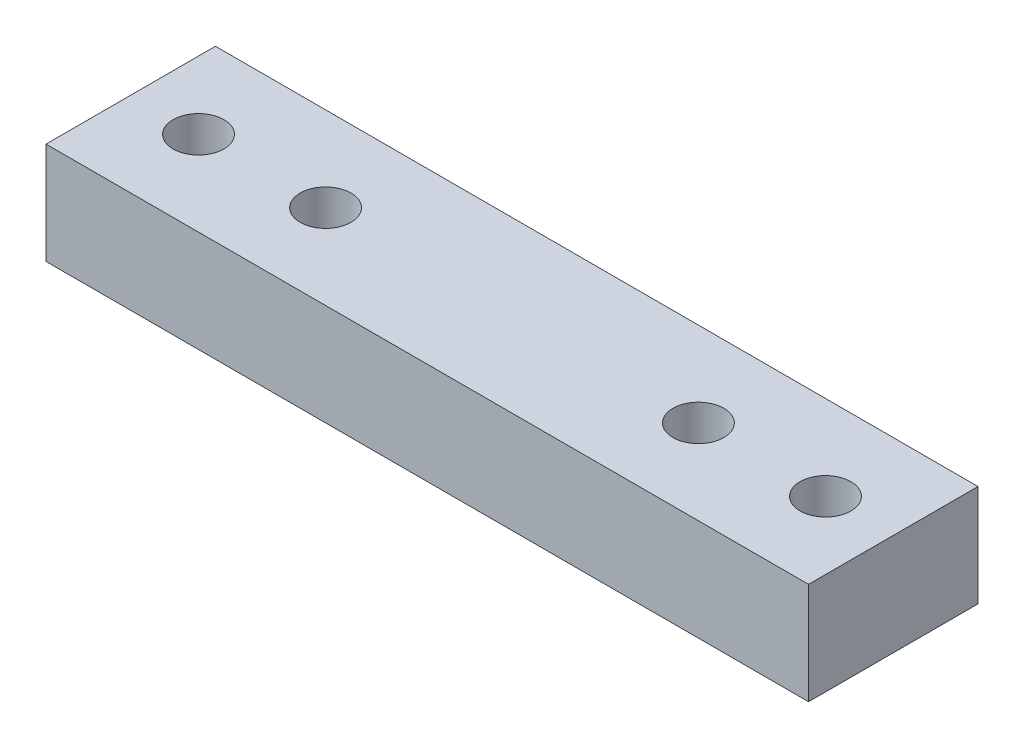
ISO-10303-21;
HEADER;
FILE_DESCRIPTION(('STEP AP214'),'2;1');
FILE_NAME('part.step','',(''),(''),'','','');
FILE_SCHEMA(('AUTOMOTIVE_DESIGN { 1 0 10303 214 1 1 1 1 }'));
ENDSEC;
DATA;
#1=APPLICATION_CONTEXT('core data for automotive mechanical design processes');
#2=APPLICATION_PROTOCOL_DEFINITION('international standard','automotive_design',2000,#1);
#3=PRODUCT_CONTEXT('',#1,'mechanical');
#4=PRODUCT('Part','Part','',(#3));
#5=PRODUCT_RELATED_PRODUCT_CATEGORY('part','',(#4));
#6=PRODUCT_DEFINITION_FORMATION('','',#4);
#7=PRODUCT_DEFINITION_CONTEXT('part definition',#1,'design');
#8=PRODUCT_DEFINITION('design','',#6,#7);
#9=PRODUCT_DEFINITION_SHAPE('','',#8);
#10=(LENGTH_UNIT() NAMED_UNIT(*) SI_UNIT(.MILLI.,.METRE.));
#11=(NAMED_UNIT(*) PLANE_ANGLE_UNIT() SI_UNIT($,.RADIAN.));
#12=(NAMED_UNIT(*) SI_UNIT($,.STERADIAN.) SOLID_ANGLE_UNIT());
#13=UNCERTAINTY_MEASURE_WITH_UNIT(LENGTH_MEASURE(1.E-05),#10,'distance_accuracy_value','');
#14=(GEOMETRIC_REPRESENTATION_CONTEXT(3) GLOBAL_UNCERTAINTY_ASSIGNED_CONTEXT((#13)) GLOBAL_UNIT_ASSIGNED_CONTEXT((#10,
#11,#12)) REPRESENTATION_CONTEXT('',''));
#15=CARTESIAN_POINT('',(0.,0.,0.));
#16=DIRECTION('',(0.,0.,1.));
#17=DIRECTION('',(1.,0.,0.));
#18=AXIS2_PLACEMENT_3D('',#15,#16,#17);
#19=CARTESIAN_POINT('',(0.,6.,0.));
#20=DIRECTION('',(0.,1.,0.));
#21=DIRECTION('',(0.,0.,1.));
#22=AXIS2_PLACEMENT_3D('',#19,#20,#21);
#23=PLANE('',#22);
#24=CARTESIAN_POINT('',(22.4036731046592,6.,-1.50232018561485));
#25=DIRECTION('',(0.,1.,0.));
#26=DIRECTION('',(0.,0.,-1.));
#27=AXIS2_PLACEMENT_3D('',#24,#25,#26);
#28=CIRCLE('',#27,1.5);
#29=CARTESIAN_POINT('',(22.4036731046592,6.,-3.00232018561485));
#30=VERTEX_POINT('',#29);
#31=EDGE_CURVE('E121',#30,#30,#28,.T.);
#32=ORIENTED_EDGE('',*,*,#31,.F.);
#33=EDGE_LOOP('',(#32));
#34=FACE_BOUND('',#33,.T.);
#35=CARTESIAN_POINT('',(-14.5963268953408,6.,-1.50232018561485));
#36=DIRECTION('',(0.,1.,0.));
#37=DIRECTION('',(0.,0.,1.));
#38=AXIS2_PLACEMENT_3D('',#35,#36,#37);
#39=CIRCLE('',#38,1.5);
#40=CARTESIAN_POINT('',(-14.5963268953408,6.,-0.00232018561484824));
#41=VERTEX_POINT('',#40);
#42=EDGE_CURVE('E100',#41,#41,#39,.T.);
#43=ORIENTED_EDGE('',*,*,#42,.F.);
#44=EDGE_LOOP('',(#43));
#45=FACE_BOUND('',#44,.T.);
#46=DIRECTION('',(0.,0.,1.));
#47=VECTOR('',#46,1.);
#48=CARTESIAN_POINT('',(-18.5963268953408,6.,-6.50232018561485));
#49=LINE('',#48,#47);
#50=CARTESIAN_POINT('',(-18.5963268953408,6.,-6.50232018561485));
#51=VERTEX_POINT('',#50);
#52=CARTESIAN_POINT('',(-18.5963268953408,6.,3.49767981438515));
#53=VERTEX_POINT('',#52);
#54=EDGE_CURVE('E85',#51,#53,#49,.T.);
#55=ORIENTED_EDGE('',*,*,#54,.T.);
#56=DIRECTION('',(1.,0.,0.));
#57=VECTOR('',#56,1.);
#58=CARTESIAN_POINT('',(-18.5963268953408,6.,3.49767981438515));
#59=LINE('',#58,#57);
#60=CARTESIAN_POINT('',(26.4036731046592,6.,3.49767981438515));
#61=VERTEX_POINT('',#60);
#62=EDGE_CURVE('E80',#53,#61,#59,.T.);
#63=ORIENTED_EDGE('',*,*,#62,.T.);
#64=DIRECTION('',(0.,0.,-1.));
#65=VECTOR('',#64,1.);
#66=CARTESIAN_POINT('',(26.4036731046592,6.,-6.50232018561485));
#67=LINE('',#66,#65);
#68=CARTESIAN_POINT('',(26.4036731046592,6.,-6.50232018561485));
#69=VERTEX_POINT('',#68);
#70=EDGE_CURVE('E83',#61,#69,#67,.T.);
#71=ORIENTED_EDGE('',*,*,#70,.T.);
#72=DIRECTION('',(-1.,0.,0.));
#73=VECTOR('',#72,1.);
#74=CARTESIAN_POINT('',(-18.5963268953408,6.,-6.50232018561485));
#75=LINE('',#74,#73);
#76=EDGE_CURVE('E50',#69,#51,#75,.T.);
#77=ORIENTED_EDGE('',*,*,#76,.T.);
#78=EDGE_LOOP('',(#55,#63,#71,#77));
#79=FACE_BOUND('',#78,.T.);
#80=CARTESIAN_POINT('',(-7.0963268953408,6.,-1.50232018561485));
#81=DIRECTION('',(0.,1.,0.));
#82=DIRECTION('',(0.,0.,1.));
#83=AXIS2_PLACEMENT_3D('',#80,#81,#82);
#84=CIRCLE('',#83,1.5);
#85=CARTESIAN_POINT('',(-7.0963268953408,6.,-0.00232018561484803));
#86=VERTEX_POINT('',#85);
#87=EDGE_CURVE('E115',#86,#86,#84,.T.);
#88=ORIENTED_EDGE('',*,*,#87,.F.);
#89=EDGE_LOOP('',(#88));
#90=FACE_BOUND('',#89,.T.);
#91=CARTESIAN_POINT('',(14.9036731046592,6.,-1.50232018561485));
#92=DIRECTION('',(0.,1.,0.));
#93=DIRECTION('',(0.,0.,-1.));
#94=AXIS2_PLACEMENT_3D('',#91,#92,#93);
#95=CIRCLE('',#94,1.5);
#96=CARTESIAN_POINT('',(14.9036731046592,6.,-3.00232018561485));
#97=VERTEX_POINT('',#96);
#98=EDGE_CURVE('E127',#97,#97,#95,.T.);
#99=ORIENTED_EDGE('',*,*,#98,.F.);
#100=EDGE_LOOP('',(#99));
#101=FACE_BOUND('',#100,.T.);
#102=ADVANCED_FACE('F33',(#34,#45,#79,#90,#101),#23,.T.);
#103=CARTESIAN_POINT('',(0.,0.,0.));
#104=DIRECTION('',(0.,1.,0.));
#105=DIRECTION('',(0.,0.,1.));
#106=AXIS2_PLACEMENT_3D('',#103,#104,#105);
#107=PLANE('',#106);
#108=DIRECTION('',(0.,0.,1.));
#109=VECTOR('',#108,1.);
#110=CARTESIAN_POINT('',(-18.5963268953408,0.,-6.50232018561485));
#111=LINE('',#110,#109);
#112=CARTESIAN_POINT('',(-18.5963268953408,0.,-6.50232018561485));
#113=VERTEX_POINT('',#112);
#114=CARTESIAN_POINT('',(-18.5963268953408,0.,3.49767981438515));
#115=VERTEX_POINT('',#114);
#116=EDGE_CURVE('E97',#113,#115,#111,.T.);
#117=ORIENTED_EDGE('',*,*,#116,.F.);
#118=DIRECTION('',(-1.,0.,0.));
#119=VECTOR('',#118,1.);
#120=CARTESIAN_POINT('',(-18.5963268953408,0.,-6.50232018561485));
#121=LINE('',#120,#119);
#122=CARTESIAN_POINT('',(26.4036731046592,0.,-6.50232018561485));
#123=VERTEX_POINT('',#122);
#124=EDGE_CURVE('E73',#123,#113,#121,.T.);
#125=ORIENTED_EDGE('',*,*,#124,.F.);
#126=DIRECTION('',(0.,0.,-1.));
#127=VECTOR('',#126,1.);
#128=CARTESIAN_POINT('',(26.4036731046592,0.,-6.50232018561485));
#129=LINE('',#128,#127);
#130=CARTESIAN_POINT('',(26.4036731046592,0.,3.49767981438515));
#131=VERTEX_POINT('',#130);
#132=EDGE_CURVE('E67',#131,#123,#129,.T.);
#133=ORIENTED_EDGE('',*,*,#132,.F.);
#134=DIRECTION('',(1.,0.,0.));
#135=VECTOR('',#134,1.);
#136=CARTESIAN_POINT('',(-18.5963268953408,0.,3.49767981438515));
#137=LINE('',#136,#135);
#138=EDGE_CURVE('E89',#115,#131,#137,.T.);
#139=ORIENTED_EDGE('',*,*,#138,.F.);
#140=EDGE_LOOP('',(#117,#125,#133,#139));
#141=FACE_BOUND('',#140,.T.);
#142=CARTESIAN_POINT('',(-14.5963268953408,0.,-1.50232018561485));
#143=DIRECTION('',(0.,1.,0.));
#144=DIRECTION('',(0.,0.,1.));
#145=AXIS2_PLACEMENT_3D('',#142,#143,#144);
#146=CIRCLE('',#145,1.5);
#147=CARTESIAN_POINT('',(-14.5963268953408,0.,-0.00232018561484824));
#148=VERTEX_POINT('',#147);
#149=EDGE_CURVE('E112',#148,#148,#146,.T.);
#150=ORIENTED_EDGE('',*,*,#149,.T.);
#151=EDGE_LOOP('',(#150));
#152=FACE_BOUND('',#151,.T.);
#153=CARTESIAN_POINT('',(-7.0963268953408,0.,-1.50232018561485));
#154=DIRECTION('',(0.,1.,0.));
#155=DIRECTION('',(0.,0.,1.));
#156=AXIS2_PLACEMENT_3D('',#153,#154,#155);
#157=CIRCLE('',#156,1.5);
#158=CARTESIAN_POINT('',(-7.0963268953408,0.,-0.00232018561484803));
#159=VERTEX_POINT('',#158);
#160=EDGE_CURVE('E118',#159,#159,#157,.T.);
#161=ORIENTED_EDGE('',*,*,#160,.T.);
#162=EDGE_LOOP('',(#161));
#163=FACE_BOUND('',#162,.T.);
#164=CARTESIAN_POINT('',(22.4036731046592,0.,-1.50232018561485));
#165=DIRECTION('',(0.,1.,0.));
#166=DIRECTION('',(0.,0.,-1.));
#167=AXIS2_PLACEMENT_3D('',#164,#165,#166);
#168=CIRCLE('',#167,1.5);
#169=CARTESIAN_POINT('',(22.4036731046592,0.,-3.00232018561485));
#170=VERTEX_POINT('',#169);
#171=EDGE_CURVE('E124',#170,#170,#168,.T.);
#172=ORIENTED_EDGE('',*,*,#171,.T.);
#173=EDGE_LOOP('',(#172));
#174=FACE_BOUND('',#173,.T.);
#175=CARTESIAN_POINT('',(14.9036731046592,0.,-1.50232018561485));
#176=DIRECTION('',(0.,1.,0.));
#177=DIRECTION('',(0.,0.,-1.));
#178=AXIS2_PLACEMENT_3D('',#175,#176,#177);
#179=CIRCLE('',#178,1.5);
#180=CARTESIAN_POINT('',(14.9036731046592,0.,-3.00232018561485));
#181=VERTEX_POINT('',#180);
#182=EDGE_CURVE('E130',#181,#181,#179,.T.);
#183=ORIENTED_EDGE('',*,*,#182,.T.);
#184=EDGE_LOOP('',(#183));
#185=FACE_BOUND('',#184,.T.);
#186=ADVANCED_FACE('F108',(#141,#152,#163,#174,#185),#107,.F.);
#187=CARTESIAN_POINT('',(-18.5963268953408,6.,-6.50232018561485));
#188=DIRECTION('',(1.,0.,0.));
#189=DIRECTION('',(0.,0.,-1.));
#190=AXIS2_PLACEMENT_3D('',#187,#188,#189);
#191=PLANE('',#190);
#192=ORIENTED_EDGE('',*,*,#116,.T.);
#193=DIRECTION('',(0.,-1.,0.));
#194=VECTOR('',#193,1.);
#195=CARTESIAN_POINT('',(-18.5963268953408,6.,3.49767981438515));
#196=LINE('',#195,#194);
#197=EDGE_CURVE('E11',#53,#115,#196,.T.);
#198=ORIENTED_EDGE('',*,*,#197,.F.);
#199=ORIENTED_EDGE('',*,*,#54,.F.);
#200=DIRECTION('',(0.,-1.,0.));
#201=VECTOR('',#200,1.);
#202=CARTESIAN_POINT('',(-18.5963268953408,6.,-6.50232018561485));
#203=LINE('',#202,#201);
#204=EDGE_CURVE('E93',#51,#113,#203,.T.);
#205=ORIENTED_EDGE('',*,*,#204,.T.);
#206=EDGE_LOOP('',(#192,#198,#199,#205));
#207=FACE_BOUND('',#206,.T.);
#208=ADVANCED_FACE('F35',(#207),#191,.F.);
#209=CARTESIAN_POINT('',(-18.5963268953408,6.,3.49767981438515));
#210=DIRECTION('',(0.,0.,-1.));
#211=DIRECTION('',(-1.,0.,0.));
#212=AXIS2_PLACEMENT_3D('',#209,#210,#211);
#213=PLANE('',#212);
#214=ORIENTED_EDGE('',*,*,#138,.T.);
#215=DIRECTION('',(0.,-1.,0.));
#216=VECTOR('',#215,1.);
#217=CARTESIAN_POINT('',(26.4036731046592,6.,3.49767981438515));
#218=LINE('',#217,#216);
#219=EDGE_CURVE('E42',#61,#131,#218,.T.);
#220=ORIENTED_EDGE('',*,*,#219,.F.);
#221=ORIENTED_EDGE('',*,*,#62,.F.);
#222=ORIENTED_EDGE('',*,*,#197,.T.);
#223=EDGE_LOOP('',(#214,#220,#221,#222));
#224=FACE_BOUND('',#223,.T.);
#225=ADVANCED_FACE('F88',(#224),#213,.F.);
#226=CARTESIAN_POINT('',(26.4036731046592,6.,-6.50232018561485));
#227=DIRECTION('',(-1.,0.,0.));
#228=DIRECTION('',(0.,0.,1.));
#229=AXIS2_PLACEMENT_3D('',#226,#227,#228);
#230=PLANE('',#229);
#231=ORIENTED_EDGE('',*,*,#132,.T.);
#232=DIRECTION('',(0.,-1.,0.));
#233=VECTOR('',#232,1.);
#234=CARTESIAN_POINT('',(26.4036731046592,6.,-6.50232018561485));
#235=LINE('',#234,#233);
#236=EDGE_CURVE('E90',#69,#123,#235,.T.);
#237=ORIENTED_EDGE('',*,*,#236,.F.);
#238=ORIENTED_EDGE('',*,*,#70,.F.);
#239=ORIENTED_EDGE('',*,*,#219,.T.);
#240=EDGE_LOOP('',(#231,#237,#238,#239));
#241=FACE_BOUND('',#240,.T.);
#242=ADVANCED_FACE('F91',(#241),#230,.F.);
#243=CARTESIAN_POINT('',(-18.5963268953408,6.,-6.50232018561485));
#244=DIRECTION('',(0.,0.,1.));
#245=DIRECTION('',(1.,0.,0.));
#246=AXIS2_PLACEMENT_3D('',#243,#244,#245);
#247=PLANE('',#246);
#248=ORIENTED_EDGE('',*,*,#124,.T.);
#249=ORIENTED_EDGE('',*,*,#204,.F.);
#250=ORIENTED_EDGE('',*,*,#76,.F.);
#251=ORIENTED_EDGE('',*,*,#236,.T.);
#252=EDGE_LOOP('',(#248,#249,#250,#251));
#253=FACE_BOUND('',#252,.T.);
#254=ADVANCED_FACE('F105',(#253),#247,.F.);
#255=CARTESIAN_POINT('',(-14.5963268953408,6.,-1.50232018561485));
#256=DIRECTION('',(0.,-1.,0.));
#257=DIRECTION('',(0.,0.,-1.));
#258=AXIS2_PLACEMENT_3D('',#255,#256,#257);
#259=CYLINDRICAL_SURFACE('',#258,1.5);
#260=ORIENTED_EDGE('',*,*,#42,.T.);
#261=EDGE_LOOP('',(#260));
#262=FACE_BOUND('',#261,.T.);
#263=ORIENTED_EDGE('',*,*,#149,.F.);
#264=EDGE_LOOP('',(#263));
#265=FACE_BOUND('',#264,.T.);
#266=ADVANCED_FACE('F149',(#262,#265),#259,.F.);
#267=CARTESIAN_POINT('',(-7.0963268953408,6.,-1.50232018561485));
#268=DIRECTION('',(0.,-1.,0.));
#269=DIRECTION('',(0.,0.,-1.));
#270=AXIS2_PLACEMENT_3D('',#267,#268,#269);
#271=CYLINDRICAL_SURFACE('',#270,1.5);
#272=ORIENTED_EDGE('',*,*,#87,.T.);
#273=EDGE_LOOP('',(#272));
#274=FACE_BOUND('',#273,.T.);
#275=ORIENTED_EDGE('',*,*,#160,.F.);
#276=EDGE_LOOP('',(#275));
#277=FACE_BOUND('',#276,.T.);
#278=ADVANCED_FACE('F195',(#274,#277),#271,.F.);
#279=CARTESIAN_POINT('',(22.4036731046592,6.,-1.50232018561485));
#280=DIRECTION('',(0.,-1.,0.));
#281=DIRECTION('',(0.,0.,-1.));
#282=AXIS2_PLACEMENT_3D('',#279,#280,#281);
#283=CYLINDRICAL_SURFACE('',#282,1.5);
#284=ORIENTED_EDGE('',*,*,#31,.T.);
#285=EDGE_LOOP('',(#284));
#286=FACE_BOUND('',#285,.T.);
#287=ORIENTED_EDGE('',*,*,#171,.F.);
#288=EDGE_LOOP('',(#287));
#289=FACE_BOUND('',#288,.T.);
#290=ADVANCED_FACE('F203',(#286,#289),#283,.F.);
#291=CARTESIAN_POINT('',(14.9036731046592,6.,-1.50232018561485));
#292=DIRECTION('',(0.,-1.,0.));
#293=DIRECTION('',(0.,0.,-1.));
#294=AXIS2_PLACEMENT_3D('',#291,#292,#293);
#295=CYLINDRICAL_SURFACE('',#294,1.5);
#296=ORIENTED_EDGE('',*,*,#98,.T.);
#297=EDGE_LOOP('',(#296));
#298=FACE_BOUND('',#297,.T.);
#299=ORIENTED_EDGE('',*,*,#182,.F.);
#300=EDGE_LOOP('',(#299));
#301=FACE_BOUND('',#300,.T.);
#302=ADVANCED_FACE('F136',(#298,#301),#295,.F.);
#303=CLOSED_SHELL('',(#102,#186,#208,#225,#242,#254,#266,#278,#290,#302));
#304=MANIFOLD_SOLID_BREP('B2',#303);
#305=ADVANCED_BREP_SHAPE_REPRESENTATION('',(#18,#304),#14);
#306=SHAPE_DEFINITION_REPRESENTATION(#9,#305);
ENDSEC;
END-ISO-10303-21;
